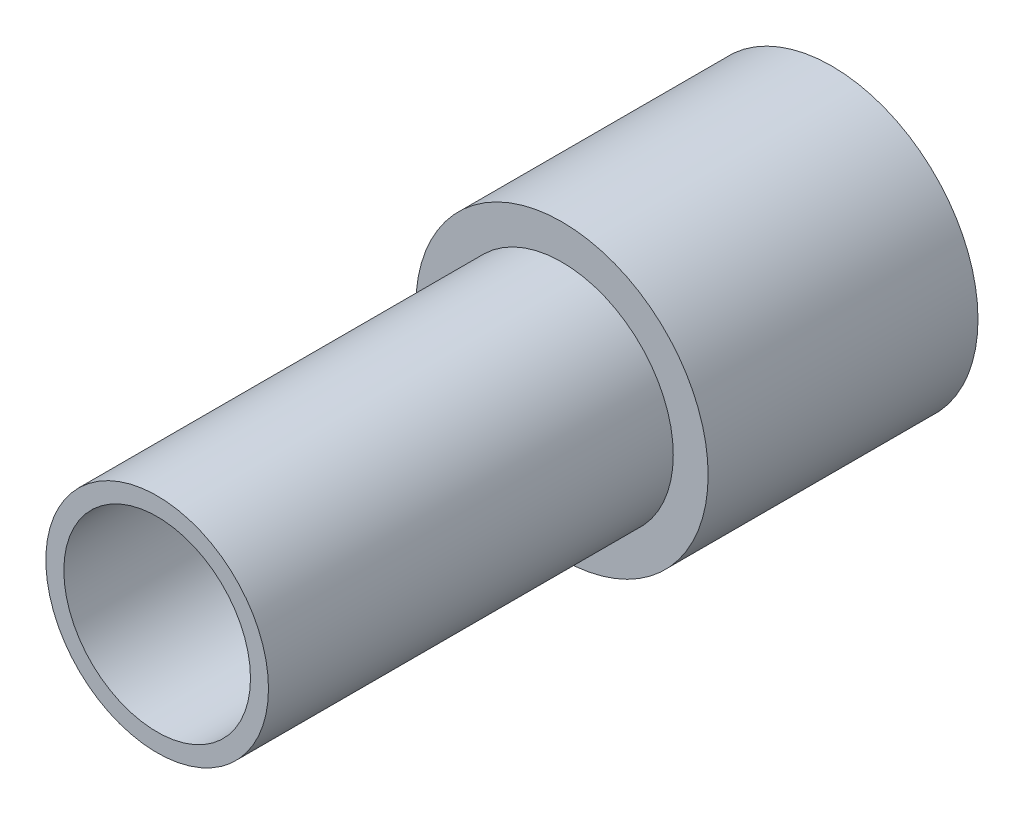
ISO-10303-21;
HEADER;
FILE_DESCRIPTION(('STEP AP214'),'2;1');
FILE_NAME('part.step','',(''),(''),'','','');
FILE_SCHEMA(('AUTOMOTIVE_DESIGN { 1 0 10303 214 1 1 1 1 }'));
ENDSEC;
DATA;
#1=APPLICATION_CONTEXT('core data for automotive mechanical design processes');
#2=APPLICATION_PROTOCOL_DEFINITION('international standard','automotive_design',2000,#1);
#3=PRODUCT_CONTEXT('',#1,'mechanical');
#4=PRODUCT('Part','Part','',(#3));
#5=PRODUCT_RELATED_PRODUCT_CATEGORY('part','',(#4));
#6=PRODUCT_DEFINITION_FORMATION('','',#4);
#7=PRODUCT_DEFINITION_CONTEXT('part definition',#1,'design');
#8=PRODUCT_DEFINITION('design','',#6,#7);
#9=PRODUCT_DEFINITION_SHAPE('','',#8);
#10=(LENGTH_UNIT() NAMED_UNIT(*) SI_UNIT(.MILLI.,.METRE.));
#11=(NAMED_UNIT(*) PLANE_ANGLE_UNIT() SI_UNIT($,.RADIAN.));
#12=(NAMED_UNIT(*) SI_UNIT($,.STERADIAN.) SOLID_ANGLE_UNIT());
#13=UNCERTAINTY_MEASURE_WITH_UNIT(LENGTH_MEASURE(1.E-05),#10,'distance_accuracy_value','');
#14=(GEOMETRIC_REPRESENTATION_CONTEXT(3) GLOBAL_UNCERTAINTY_ASSIGNED_CONTEXT((#13)) GLOBAL_UNIT_ASSIGNED_CONTEXT((#10,
#11,#12)) REPRESENTATION_CONTEXT('',''));
#15=CARTESIAN_POINT('',(0.,0.,0.));
#16=DIRECTION('',(0.,0.,1.));
#17=DIRECTION('',(1.,0.,0.));
#18=AXIS2_PLACEMENT_3D('',#15,#16,#17);
#19=CARTESIAN_POINT('',(0.,0.,30.));
#20=DIRECTION('',(0.,0.,1.));
#21=DIRECTION('',(1.,0.,0.));
#22=AXIS2_PLACEMENT_3D('',#19,#20,#21);
#23=PLANE('',#22);
#24=CARTESIAN_POINT('',(0.,0.,30.));
#25=DIRECTION('',(0.,0.,1.));
#26=DIRECTION('',(1.,0.,0.));
#27=AXIS2_PLACEMENT_3D('',#24,#25,#26);
#28=CIRCLE('',#27,4.15);
#29=CARTESIAN_POINT('',(4.15,0.,30.));
#30=VERTEX_POINT('',#29);
#31=EDGE_CURVE('E38',#30,#30,#28,.T.);
#32=ORIENTED_EDGE('',*,*,#31,.F.);
#33=EDGE_LOOP('',(#32));
#34=FACE_BOUND('',#33,.T.);
#35=CARTESIAN_POINT('',(0.,0.,30.));
#36=DIRECTION('',(0.,0.,1.));
#37=DIRECTION('',(1.,0.,0.));
#38=AXIS2_PLACEMENT_3D('',#35,#36,#37);
#39=CIRCLE('',#38,4.95);
#40=CARTESIAN_POINT('',(4.95,0.,30.));
#41=VERTEX_POINT('',#40);
#42=EDGE_CURVE('E52',#41,#41,#39,.T.);
#43=ORIENTED_EDGE('',*,*,#42,.T.);
#44=EDGE_LOOP('',(#43));
#45=FACE_BOUND('',#44,.T.);
#46=ADVANCED_FACE('F31',(#34,#45),#23,.T.);
#47=CARTESIAN_POINT('',(0.,0.,30.));
#48=DIRECTION('',(0.,0.,-1.));
#49=DIRECTION('',(-1.,0.,0.));
#50=AXIS2_PLACEMENT_3D('',#47,#48,#49);
#51=CYLINDRICAL_SURFACE('',#50,6.5);
#52=CARTESIAN_POINT('',(0.,0.,0.));
#53=DIRECTION('',(0.,0.,1.));
#54=DIRECTION('',(1.,0.,0.));
#55=AXIS2_PLACEMENT_3D('',#52,#53,#54);
#56=CIRCLE('',#55,6.5);
#57=CARTESIAN_POINT('',(6.5,0.,0.));
#58=VERTEX_POINT('',#57);
#59=EDGE_CURVE('E10',#58,#58,#56,.T.);
#60=ORIENTED_EDGE('',*,*,#59,.T.);
#61=EDGE_LOOP('',(#60));
#62=FACE_BOUND('',#61,.T.);
#63=CARTESIAN_POINT('',(0.,0.,12.));
#64=DIRECTION('',(0.,0.,1.));
#65=DIRECTION('',(1.,0.,0.));
#66=AXIS2_PLACEMENT_3D('',#63,#64,#65);
#67=CIRCLE('',#66,6.5);
#68=CARTESIAN_POINT('',(6.5,0.,12.));
#69=VERTEX_POINT('',#68);
#70=EDGE_CURVE('E47',#69,#69,#67,.T.);
#71=ORIENTED_EDGE('',*,*,#70,.F.);
#72=EDGE_LOOP('',(#71));
#73=FACE_BOUND('',#72,.T.);
#74=ADVANCED_FACE('F33',(#62,#73),#51,.T.);
#75=CARTESIAN_POINT('',(0.,0.,0.));
#76=DIRECTION('',(0.,0.,1.));
#77=DIRECTION('',(1.,0.,0.));
#78=AXIS2_PLACEMENT_3D('',#75,#76,#77);
#79=PLANE('',#78);
#80=ORIENTED_EDGE('',*,*,#59,.F.);
#81=EDGE_LOOP('',(#80));
#82=FACE_BOUND('',#81,.T.);
#83=CARTESIAN_POINT('',(0.,0.,0.));
#84=DIRECTION('',(0.,0.,1.));
#85=DIRECTION('',(1.,0.,0.));
#86=AXIS2_PLACEMENT_3D('',#83,#84,#85);
#87=CIRCLE('',#86,4.15);
#88=CARTESIAN_POINT('',(4.15,0.,0.));
#89=VERTEX_POINT('',#88);
#90=EDGE_CURVE('E42',#89,#89,#87,.T.);
#91=ORIENTED_EDGE('',*,*,#90,.T.);
#92=EDGE_LOOP('',(#91));
#93=FACE_BOUND('',#92,.T.);
#94=ADVANCED_FACE('F69',(#82,#93),#79,.F.);
#95=CARTESIAN_POINT('',(0.,0.,30.));
#96=DIRECTION('',(0.,0.,-1.));
#97=DIRECTION('',(-1.,0.,0.));
#98=AXIS2_PLACEMENT_3D('',#95,#96,#97);
#99=CYLINDRICAL_SURFACE('',#98,4.15);
#100=ORIENTED_EDGE('',*,*,#31,.T.);
#101=EDGE_LOOP('',(#100));
#102=FACE_BOUND('',#101,.T.);
#103=ORIENTED_EDGE('',*,*,#90,.F.);
#104=EDGE_LOOP('',(#103));
#105=FACE_BOUND('',#104,.T.);
#106=ADVANCED_FACE('F64',(#102,#105),#99,.F.);
#107=CARTESIAN_POINT('',(0.,0.,12.));
#108=DIRECTION('',(0.,0.,1.));
#109=DIRECTION('',(1.,0.,0.));
#110=AXIS2_PLACEMENT_3D('',#107,#108,#109);
#111=PLANE('',#110);
#112=CARTESIAN_POINT('',(0.,0.,12.));
#113=DIRECTION('',(0.,0.,1.));
#114=DIRECTION('',(1.,0.,0.));
#115=AXIS2_PLACEMENT_3D('',#112,#113,#114);
#116=CIRCLE('',#115,4.95);
#117=CARTESIAN_POINT('',(4.95,0.,12.));
#118=VERTEX_POINT('',#117);
#119=EDGE_CURVE('E51',#118,#118,#116,.T.);
#120=ORIENTED_EDGE('',*,*,#119,.F.);
#121=EDGE_LOOP('',(#120));
#122=FACE_BOUND('',#121,.T.);
#123=ORIENTED_EDGE('',*,*,#70,.T.);
#124=EDGE_LOOP('',(#123));
#125=FACE_BOUND('',#124,.T.);
#126=ADVANCED_FACE('F61',(#122,#125),#111,.T.);
#127=CARTESIAN_POINT('',(0.,0.,12.));
#128=DIRECTION('',(0.,0.,1.));
#129=DIRECTION('',(1.,0.,0.));
#130=AXIS2_PLACEMENT_3D('',#127,#128,#129);
#131=CYLINDRICAL_SURFACE('',#130,4.95);
#132=ORIENTED_EDGE('',*,*,#119,.T.);
#133=EDGE_LOOP('',(#132));
#134=FACE_BOUND('',#133,.T.);
#135=ORIENTED_EDGE('',*,*,#42,.F.);
#136=EDGE_LOOP('',(#135));
#137=FACE_BOUND('',#136,.T.);
#138=ADVANCED_FACE('F58',(#134,#137),#131,.T.);
#139=CLOSED_SHELL('',(#46,#74,#94,#106,#126,#138));
#140=MANIFOLD_SOLID_BREP('B2',#139);
#141=ADVANCED_BREP_SHAPE_REPRESENTATION('',(#18,#140),#14);
#142=SHAPE_DEFINITION_REPRESENTATION(#9,#141);
ENDSEC;
END-ISO-10303-21;
